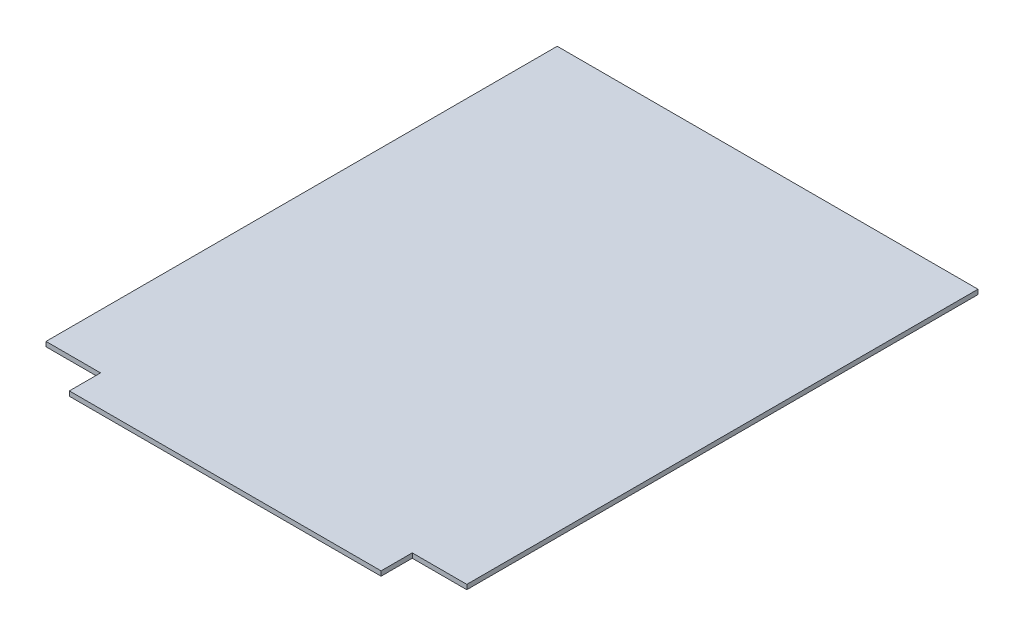
ISO-10303-21;
HEADER;
FILE_DESCRIPTION(('STEP AP214'),'2;1');
FILE_NAME('part.step','',(''),(''),'','','');
FILE_SCHEMA(('AUTOMOTIVE_DESIGN { 1 0 10303 214 1 1 1 1 }'));
ENDSEC;
DATA;
#1=APPLICATION_CONTEXT('core data for automotive mechanical design processes');
#2=APPLICATION_PROTOCOL_DEFINITION('international standard','automotive_design',2000,#1);
#3=PRODUCT_CONTEXT('',#1,'mechanical');
#4=PRODUCT('Part','Part','',(#3));
#5=PRODUCT_RELATED_PRODUCT_CATEGORY('part','',(#4));
#6=PRODUCT_DEFINITION_FORMATION('','',#4);
#7=PRODUCT_DEFINITION_CONTEXT('part definition',#1,'design');
#8=PRODUCT_DEFINITION('design','',#6,#7);
#9=PRODUCT_DEFINITION_SHAPE('','',#8);
#10=(LENGTH_UNIT() NAMED_UNIT(*) SI_UNIT(.MILLI.,.METRE.));
#11=(NAMED_UNIT(*) PLANE_ANGLE_UNIT() SI_UNIT($,.RADIAN.));
#12=(NAMED_UNIT(*) SI_UNIT($,.STERADIAN.) SOLID_ANGLE_UNIT());
#13=UNCERTAINTY_MEASURE_WITH_UNIT(LENGTH_MEASURE(1.E-05),#10,'distance_accuracy_value','');
#14=(GEOMETRIC_REPRESENTATION_CONTEXT(3) GLOBAL_UNCERTAINTY_ASSIGNED_CONTEXT((#13)) GLOBAL_UNIT_ASSIGNED_CONTEXT((#10,
#11,#12)) REPRESENTATION_CONTEXT('',''));
#15=CARTESIAN_POINT('',(0.,0.,0.));
#16=DIRECTION('',(0.,0.,1.));
#17=DIRECTION('',(1.,0.,0.));
#18=AXIS2_PLACEMENT_3D('',#15,#16,#17);
#19=CARTESIAN_POINT('',(99.9999999999997,3.,-1.38777878078144E-13));
#20=DIRECTION('',(1.,0.,0.));
#21=DIRECTION('',(0.,0.,-1.));
#22=AXIS2_PLACEMENT_3D('',#19,#20,#21);
#23=PLANE('',#22);
#24=DIRECTION('',(0.,0.,1.));
#25=VECTOR('',#24,1.);
#26=CARTESIAN_POINT('',(99.9999999999997,0.,-1.38777878078144E-13));
#27=LINE('',#26,#25);
#28=CARTESIAN_POINT('',(99.9999999999999,0.,164.));
#29=VERTEX_POINT('',#28);
#30=CARTESIAN_POINT('',(100.,0.,184.));
#31=VERTEX_POINT('',#30);
#32=EDGE_CURVE('E133',#29,#31,#27,.T.);
#33=ORIENTED_EDGE('',*,*,#32,.F.);
#34=DIRECTION('',(0.,-1.,0.));
#35=VECTOR('',#34,1.);
#36=CARTESIAN_POINT('',(99.9999999999999,3.,164.));
#37=LINE('',#36,#35);
#38=CARTESIAN_POINT('',(99.9999999999999,3.,164.));
#39=VERTEX_POINT('',#38);
#40=EDGE_CURVE('E11',#39,#29,#37,.T.);
#41=ORIENTED_EDGE('',*,*,#40,.F.);
#42=DIRECTION('',(0.,0.,1.));
#43=VECTOR('',#42,1.);
#44=CARTESIAN_POINT('',(99.9999999999997,3.,-1.38777878078144E-13));
#45=LINE('',#44,#43);
#46=CARTESIAN_POINT('',(100.,3.,184.));
#47=VERTEX_POINT('',#46);
#48=EDGE_CURVE('E150',#39,#47,#45,.T.);
#49=ORIENTED_EDGE('',*,*,#48,.T.);
#50=DIRECTION('',(0.,-1.,0.));
#51=VECTOR('',#50,1.);
#52=CARTESIAN_POINT('',(100.,3.,184.));
#53=LINE('',#52,#51);
#54=EDGE_CURVE('E89',#47,#31,#53,.T.);
#55=ORIENTED_EDGE('',*,*,#54,.T.);
#56=EDGE_LOOP('',(#33,#41,#49,#55));
#57=FACE_BOUND('',#56,.T.);
#58=ADVANCED_FACE('F38',(#57),#23,.T.);
#59=CARTESIAN_POINT('',(0.,3.,164.));
#60=DIRECTION('',(0.,0.,-1.));
#61=DIRECTION('',(-1.,0.,0.));
#62=AXIS2_PLACEMENT_3D('',#59,#60,#61);
#63=PLANE('',#62);
#64=DIRECTION('',(1.,0.,0.));
#65=VECTOR('',#64,1.);
#66=CARTESIAN_POINT('',(0.,0.,164.));
#67=LINE('',#66,#65);
#68=CARTESIAN_POINT('',(135.,0.,164.));
#69=VERTEX_POINT('',#68);
#70=EDGE_CURVE('E136',#29,#69,#67,.T.);
#71=ORIENTED_EDGE('',*,*,#70,.T.);
#72=DIRECTION('',(0.,-1.,0.));
#73=VECTOR('',#72,1.);
#74=CARTESIAN_POINT('',(135.,3.,164.));
#75=LINE('',#74,#73);
#76=CARTESIAN_POINT('',(135.,3.,164.));
#77=VERTEX_POINT('',#76);
#78=EDGE_CURVE('E46',#77,#69,#75,.T.);
#79=ORIENTED_EDGE('',*,*,#78,.F.);
#80=DIRECTION('',(1.,0.,0.));
#81=VECTOR('',#80,1.);
#82=CARTESIAN_POINT('',(0.,3.,164.));
#83=LINE('',#82,#81);
#84=EDGE_CURVE('E119',#39,#77,#83,.T.);
#85=ORIENTED_EDGE('',*,*,#84,.F.);
#86=ORIENTED_EDGE('',*,*,#40,.T.);
#87=EDGE_LOOP('',(#71,#79,#85,#86));
#88=FACE_BOUND('',#87,.T.);
#89=ADVANCED_FACE('F177',(#88),#63,.F.);
#90=CARTESIAN_POINT('',(135.,3.,0.));
#91=DIRECTION('',(-1.,0.,0.));
#92=DIRECTION('',(0.,0.,1.));
#93=AXIS2_PLACEMENT_3D('',#90,#91,#92);
#94=PLANE('',#93);
#95=DIRECTION('',(0.,0.,-1.));
#96=VECTOR('',#95,1.);
#97=CARTESIAN_POINT('',(135.,0.,0.));
#98=LINE('',#97,#96);
#99=CARTESIAN_POINT('',(135.,0.,-164.));
#100=VERTEX_POINT('',#99);
#101=EDGE_CURVE('E138',#69,#100,#98,.T.);
#102=ORIENTED_EDGE('',*,*,#101,.T.);
#103=DIRECTION('',(0.,-1.,0.));
#104=VECTOR('',#103,1.);
#105=CARTESIAN_POINT('',(135.,3.,-164.));
#106=LINE('',#105,#104);
#107=CARTESIAN_POINT('',(135.,3.,-164.));
#108=VERTEX_POINT('',#107);
#109=EDGE_CURVE('E156',#108,#100,#106,.T.);
#110=ORIENTED_EDGE('',*,*,#109,.F.);
#111=DIRECTION('',(0.,0.,-1.));
#112=VECTOR('',#111,1.);
#113=CARTESIAN_POINT('',(135.,3.,0.));
#114=LINE('',#113,#112);
#115=EDGE_CURVE('E164',#77,#108,#114,.T.);
#116=ORIENTED_EDGE('',*,*,#115,.F.);
#117=ORIENTED_EDGE('',*,*,#78,.T.);
#118=EDGE_LOOP('',(#102,#110,#116,#117));
#119=FACE_BOUND('',#118,.T.);
#120=ADVANCED_FACE('F162',(#119),#94,.F.);
#121=CARTESIAN_POINT('',(0.,3.,-164.));
#122=DIRECTION('',(0.,0.,-1.));
#123=DIRECTION('',(-1.,0.,0.));
#124=AXIS2_PLACEMENT_3D('',#121,#122,#123);
#125=PLANE('',#124);
#126=DIRECTION('',(1.,0.,0.));
#127=VECTOR('',#126,1.);
#128=CARTESIAN_POINT('',(0.,0.,-164.));
#129=LINE('',#128,#127);
#130=CARTESIAN_POINT('',(-135.,0.,-164.));
#131=VERTEX_POINT('',#130);
#132=EDGE_CURVE('E141',#131,#100,#129,.T.);
#133=ORIENTED_EDGE('',*,*,#132,.F.);
#134=DIRECTION('',(0.,-1.,0.));
#135=VECTOR('',#134,1.);
#136=CARTESIAN_POINT('',(-135.,3.,-164.));
#137=LINE('',#136,#135);
#138=CARTESIAN_POINT('',(-135.,3.,-164.));
#139=VERTEX_POINT('',#138);
#140=EDGE_CURVE('E154',#139,#131,#137,.T.);
#141=ORIENTED_EDGE('',*,*,#140,.F.);
#142=DIRECTION('',(1.,0.,0.));
#143=VECTOR('',#142,1.);
#144=CARTESIAN_POINT('',(0.,3.,-164.));
#145=LINE('',#144,#143);
#146=EDGE_CURVE('E174',#139,#108,#145,.T.);
#147=ORIENTED_EDGE('',*,*,#146,.T.);
#148=ORIENTED_EDGE('',*,*,#109,.T.);
#149=EDGE_LOOP('',(#133,#141,#147,#148));
#150=FACE_BOUND('',#149,.T.);
#151=ADVANCED_FACE('F172',(#150),#125,.T.);
#152=CARTESIAN_POINT('',(-135.,3.,0.));
#153=DIRECTION('',(-1.,0.,0.));
#154=DIRECTION('',(0.,0.,1.));
#155=AXIS2_PLACEMENT_3D('',#152,#153,#154);
#156=PLANE('',#155);
#157=DIRECTION('',(0.,0.,-1.));
#158=VECTOR('',#157,1.);
#159=CARTESIAN_POINT('',(-135.,0.,0.));
#160=LINE('',#159,#158);
#161=CARTESIAN_POINT('',(-135.,0.,164.));
#162=VERTEX_POINT('',#161);
#163=EDGE_CURVE('E144',#162,#131,#160,.T.);
#164=ORIENTED_EDGE('',*,*,#163,.F.);
#165=DIRECTION('',(0.,-1.,0.));
#166=VECTOR('',#165,1.);
#167=CARTESIAN_POINT('',(-135.,3.,164.));
#168=LINE('',#167,#166);
#169=CARTESIAN_POINT('',(-135.,3.,164.));
#170=VERTEX_POINT('',#169);
#171=EDGE_CURVE('E124',#170,#162,#168,.T.);
#172=ORIENTED_EDGE('',*,*,#171,.F.);
#173=DIRECTION('',(0.,0.,-1.));
#174=VECTOR('',#173,1.);
#175=CARTESIAN_POINT('',(-135.,3.,0.));
#176=LINE('',#175,#174);
#177=EDGE_CURVE('E116',#170,#139,#176,.T.);
#178=ORIENTED_EDGE('',*,*,#177,.T.);
#179=ORIENTED_EDGE('',*,*,#140,.T.);
#180=EDGE_LOOP('',(#164,#172,#178,#179));
#181=FACE_BOUND('',#180,.T.);
#182=ADVANCED_FACE('F187',(#181),#156,.T.);
#183=CARTESIAN_POINT('',(-100.,0.,164.));
#184=VERTEX_POINT('',#183);
#185=EDGE_CURVE('E123',#162,#184,#67,.T.);
#186=ORIENTED_EDGE('',*,*,#185,.T.);
#187=DIRECTION('',(0.,-1.,0.));
#188=VECTOR('',#187,1.);
#189=CARTESIAN_POINT('',(-100.,3.,164.));
#190=LINE('',#189,#188);
#191=CARTESIAN_POINT('',(-100.,3.,164.));
#192=VERTEX_POINT('',#191);
#193=EDGE_CURVE('E120',#192,#184,#190,.T.);
#194=ORIENTED_EDGE('',*,*,#193,.F.);
#195=EDGE_CURVE('E109',#170,#192,#83,.T.);
#196=ORIENTED_EDGE('',*,*,#195,.F.);
#197=ORIENTED_EDGE('',*,*,#171,.T.);
#198=EDGE_LOOP('',(#186,#194,#196,#197));
#199=FACE_BOUND('',#198,.T.);
#200=ADVANCED_FACE('F121',(#199),#63,.F.);
#201=CARTESIAN_POINT('',(-100.,3.,0.));
#202=DIRECTION('',(1.,0.,0.));
#203=DIRECTION('',(0.,0.,-1.));
#204=AXIS2_PLACEMENT_3D('',#201,#202,#203);
#205=PLANE('',#204);
#206=DIRECTION('',(0.,0.,1.));
#207=VECTOR('',#206,1.);
#208=CARTESIAN_POINT('',(-100.,0.,0.));
#209=LINE('',#208,#207);
#210=CARTESIAN_POINT('',(-100.,0.,184.));
#211=VERTEX_POINT('',#210);
#212=EDGE_CURVE('E82',#184,#211,#209,.T.);
#213=ORIENTED_EDGE('',*,*,#212,.T.);
#214=DIRECTION('',(0.,-1.,0.));
#215=VECTOR('',#214,1.);
#216=CARTESIAN_POINT('',(-100.,3.,184.));
#217=LINE('',#216,#215);
#218=CARTESIAN_POINT('',(-100.,3.,184.));
#219=VERTEX_POINT('',#218);
#220=EDGE_CURVE('E125',#219,#211,#217,.T.);
#221=ORIENTED_EDGE('',*,*,#220,.F.);
#222=DIRECTION('',(0.,0.,1.));
#223=VECTOR('',#222,1.);
#224=CARTESIAN_POINT('',(-100.,3.,0.));
#225=LINE('',#224,#223);
#226=EDGE_CURVE('E113',#192,#219,#225,.T.);
#227=ORIENTED_EDGE('',*,*,#226,.F.);
#228=ORIENTED_EDGE('',*,*,#193,.T.);
#229=EDGE_LOOP('',(#213,#221,#227,#228));
#230=FACE_BOUND('',#229,.T.);
#231=ADVANCED_FACE('F127',(#230),#205,.F.);
#232=CARTESIAN_POINT('',(0.,3.,184.));
#233=DIRECTION('',(0.,0.,-1.));
#234=DIRECTION('',(-1.,0.,0.));
#235=AXIS2_PLACEMENT_3D('',#232,#233,#234);
#236=PLANE('',#235);
#237=DIRECTION('',(1.,0.,0.));
#238=VECTOR('',#237,1.);
#239=CARTESIAN_POINT('',(0.,0.,184.));
#240=LINE('',#239,#238);
#241=EDGE_CURVE('E148',#211,#31,#240,.T.);
#242=ORIENTED_EDGE('',*,*,#241,.T.);
#243=ORIENTED_EDGE('',*,*,#54,.F.);
#244=DIRECTION('',(1.,0.,0.));
#245=VECTOR('',#244,1.);
#246=CARTESIAN_POINT('',(0.,3.,184.));
#247=LINE('',#246,#245);
#248=EDGE_CURVE('E54',#219,#47,#247,.T.);
#249=ORIENTED_EDGE('',*,*,#248,.F.);
#250=ORIENTED_EDGE('',*,*,#220,.T.);
#251=EDGE_LOOP('',(#242,#243,#249,#250));
#252=FACE_BOUND('',#251,.T.);
#253=ADVANCED_FACE('F192',(#252),#236,.F.);
#254=CARTESIAN_POINT('',(0.,3.,0.));
#255=DIRECTION('',(0.,1.,0.));
#256=DIRECTION('',(0.,0.,1.));
#257=AXIS2_PLACEMENT_3D('',#254,#255,#256);
#258=PLANE('',#257);
#259=ORIENTED_EDGE('',*,*,#48,.F.);
#260=ORIENTED_EDGE('',*,*,#84,.T.);
#261=ORIENTED_EDGE('',*,*,#115,.T.);
#262=ORIENTED_EDGE('',*,*,#146,.F.);
#263=ORIENTED_EDGE('',*,*,#177,.F.);
#264=ORIENTED_EDGE('',*,*,#195,.T.);
#265=ORIENTED_EDGE('',*,*,#226,.T.);
#266=ORIENTED_EDGE('',*,*,#248,.T.);
#267=EDGE_LOOP('',(#259,#260,#261,#262,#263,#264,#265,#266));
#268=FACE_BOUND('',#267,.T.);
#269=ADVANCED_FACE('F111',(#268),#258,.T.);
#270=CARTESIAN_POINT('',(0.,0.,0.));
#271=DIRECTION('',(0.,1.,0.));
#272=DIRECTION('',(0.,0.,1.));
#273=AXIS2_PLACEMENT_3D('',#270,#271,#272);
#274=PLANE('',#273);
#275=ORIENTED_EDGE('',*,*,#32,.T.);
#276=ORIENTED_EDGE('',*,*,#241,.F.);
#277=ORIENTED_EDGE('',*,*,#212,.F.);
#278=ORIENTED_EDGE('',*,*,#185,.F.);
#279=ORIENTED_EDGE('',*,*,#163,.T.);
#280=ORIENTED_EDGE('',*,*,#132,.T.);
#281=ORIENTED_EDGE('',*,*,#101,.F.);
#282=ORIENTED_EDGE('',*,*,#70,.F.);
#283=EDGE_LOOP('',(#275,#276,#277,#278,#279,#280,#281,#282));
#284=FACE_BOUND('',#283,.T.);
#285=ADVANCED_FACE('F168',(#284),#274,.F.);
#286=CLOSED_SHELL('',(#58,#89,#120,#151,#182,#200,#231,#253,#269,#285));
#287=MANIFOLD_SOLID_BREP('B2',#286);
#288=ADVANCED_BREP_SHAPE_REPRESENTATION('',(#18,#287),#14);
#289=SHAPE_DEFINITION_REPRESENTATION(#9,#288);
ENDSEC;
END-ISO-10303-21;
